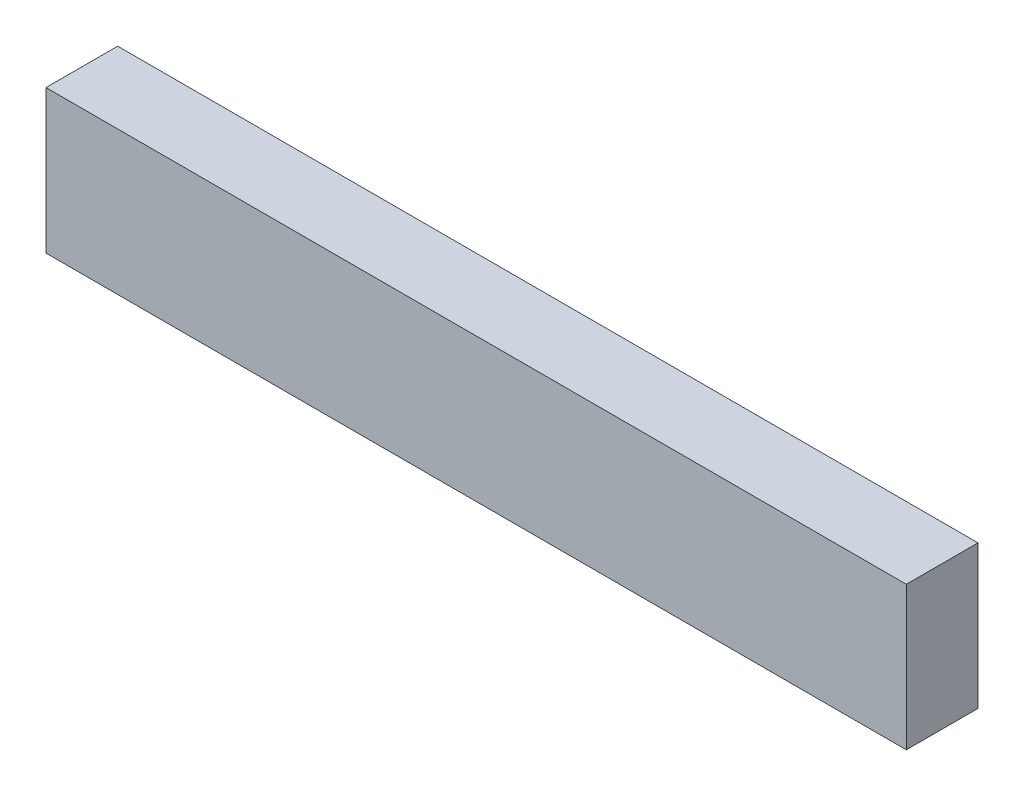
ISO-10303-21;
HEADER;
FILE_DESCRIPTION(('STEP AP214'),'2;1');
FILE_NAME('part.step','',(''),(''),'','','');
FILE_SCHEMA(('AUTOMOTIVE_DESIGN { 1 0 10303 214 1 1 1 1 }'));
ENDSEC;
DATA;
#1=APPLICATION_CONTEXT('core data for automotive mechanical design processes');
#2=APPLICATION_PROTOCOL_DEFINITION('international standard','automotive_design',2000,#1);
#3=PRODUCT_CONTEXT('',#1,'mechanical');
#4=PRODUCT('Part','Part','',(#3));
#5=PRODUCT_RELATED_PRODUCT_CATEGORY('part','',(#4));
#6=PRODUCT_DEFINITION_FORMATION('','',#4);
#7=PRODUCT_DEFINITION_CONTEXT('part definition',#1,'design');
#8=PRODUCT_DEFINITION('design','',#6,#7);
#9=PRODUCT_DEFINITION_SHAPE('','',#8);
#10=(LENGTH_UNIT() NAMED_UNIT(*) SI_UNIT(.MILLI.,.METRE.));
#11=(NAMED_UNIT(*) PLANE_ANGLE_UNIT() SI_UNIT($,.RADIAN.));
#12=(NAMED_UNIT(*) SI_UNIT($,.STERADIAN.) SOLID_ANGLE_UNIT());
#13=UNCERTAINTY_MEASURE_WITH_UNIT(LENGTH_MEASURE(1.E-05),#10,'distance_accuracy_value','');
#14=(GEOMETRIC_REPRESENTATION_CONTEXT(3) GLOBAL_UNCERTAINTY_ASSIGNED_CONTEXT((#13)) GLOBAL_UNIT_ASSIGNED_CONTEXT((#10,
#11,#12)) REPRESENTATION_CONTEXT('',''));
#15=CARTESIAN_POINT('',(0.,0.,0.));
#16=DIRECTION('',(0.,0.,1.));
#17=DIRECTION('',(1.,0.,0.));
#18=AXIS2_PLACEMENT_3D('',#15,#16,#17);
#19=CARTESIAN_POINT('',(304.8,-50.8,50.8));
#20=DIRECTION('',(-1.,0.,0.));
#21=DIRECTION('',(0.,0.,1.));
#22=AXIS2_PLACEMENT_3D('',#19,#20,#21);
#23=PLANE('',#22);
#24=DIRECTION('',(0.,1.,0.));
#25=VECTOR('',#24,1.);
#26=CARTESIAN_POINT('',(304.8,-50.8,0.));
#27=LINE('',#26,#25);
#28=CARTESIAN_POINT('',(304.8,-50.8,0.));
#29=VERTEX_POINT('',#28);
#30=CARTESIAN_POINT('',(304.8,50.8,0.));
#31=VERTEX_POINT('',#30);
#32=EDGE_CURVE('E96',#29,#31,#27,.T.);
#33=ORIENTED_EDGE('',*,*,#32,.T.);
#34=DIRECTION('',(0.,0.,-1.));
#35=VECTOR('',#34,1.);
#36=CARTESIAN_POINT('',(304.8,50.8,50.8));
#37=LINE('',#36,#35);
#38=CARTESIAN_POINT('',(304.8,50.8,50.8));
#39=VERTEX_POINT('',#38);
#40=EDGE_CURVE('E11',#39,#31,#37,.T.);
#41=ORIENTED_EDGE('',*,*,#40,.F.);
#42=DIRECTION('',(0.,1.,0.));
#43=VECTOR('',#42,1.);
#44=CARTESIAN_POINT('',(304.8,-50.8,50.8));
#45=LINE('',#44,#43);
#46=CARTESIAN_POINT('',(304.8,-50.8,50.8));
#47=VERTEX_POINT('',#46);
#48=EDGE_CURVE('E84',#47,#39,#45,.T.);
#49=ORIENTED_EDGE('',*,*,#48,.F.);
#50=DIRECTION('',(0.,0.,-1.));
#51=VECTOR('',#50,1.);
#52=CARTESIAN_POINT('',(304.8,-50.8,50.8));
#53=LINE('',#52,#51);
#54=EDGE_CURVE('E92',#47,#29,#53,.T.);
#55=ORIENTED_EDGE('',*,*,#54,.T.);
#56=EDGE_LOOP('',(#33,#41,#49,#55));
#57=FACE_BOUND('',#56,.T.);
#58=ADVANCED_FACE('F33',(#57),#23,.F.);
#59=CARTESIAN_POINT('',(-304.8,50.8,50.8));
#60=DIRECTION('',(0.,-1.,0.));
#61=DIRECTION('',(0.,0.,-1.));
#62=AXIS2_PLACEMENT_3D('',#59,#60,#61);
#63=PLANE('',#62);
#64=DIRECTION('',(-1.,0.,0.));
#65=VECTOR('',#64,1.);
#66=CARTESIAN_POINT('',(-304.8,50.8,0.));
#67=LINE('',#66,#65);
#68=CARTESIAN_POINT('',(-304.8,50.8,0.));
#69=VERTEX_POINT('',#68);
#70=EDGE_CURVE('E88',#31,#69,#67,.T.);
#71=ORIENTED_EDGE('',*,*,#70,.T.);
#72=DIRECTION('',(0.,0.,-1.));
#73=VECTOR('',#72,1.);
#74=CARTESIAN_POINT('',(-304.8,50.8,50.8));
#75=LINE('',#74,#73);
#76=CARTESIAN_POINT('',(-304.8,50.8,50.8));
#77=VERTEX_POINT('',#76);
#78=EDGE_CURVE('E41',#77,#69,#75,.T.);
#79=ORIENTED_EDGE('',*,*,#78,.F.);
#80=DIRECTION('',(-1.,0.,0.));
#81=VECTOR('',#80,1.);
#82=CARTESIAN_POINT('',(-304.8,50.8,50.8));
#83=LINE('',#82,#81);
#84=EDGE_CURVE('E79',#39,#77,#83,.T.);
#85=ORIENTED_EDGE('',*,*,#84,.F.);
#86=ORIENTED_EDGE('',*,*,#40,.T.);
#87=EDGE_LOOP('',(#71,#79,#85,#86));
#88=FACE_BOUND('',#87,.T.);
#89=ADVANCED_FACE('F87',(#88),#63,.F.);
#90=CARTESIAN_POINT('',(-304.8,-50.8,50.8));
#91=DIRECTION('',(1.,0.,0.));
#92=DIRECTION('',(0.,0.,-1.));
#93=AXIS2_PLACEMENT_3D('',#90,#91,#92);
#94=PLANE('',#93);
#95=DIRECTION('',(0.,-1.,0.));
#96=VECTOR('',#95,1.);
#97=CARTESIAN_POINT('',(-304.8,-50.8,0.));
#98=LINE('',#97,#96);
#99=CARTESIAN_POINT('',(-304.8,-50.8,0.));
#100=VERTEX_POINT('',#99);
#101=EDGE_CURVE('E66',#69,#100,#98,.T.);
#102=ORIENTED_EDGE('',*,*,#101,.T.);
#103=DIRECTION('',(0.,0.,-1.));
#104=VECTOR('',#103,1.);
#105=CARTESIAN_POINT('',(-304.8,-50.8,50.8));
#106=LINE('',#105,#104);
#107=CARTESIAN_POINT('',(-304.8,-50.8,50.8));
#108=VERTEX_POINT('',#107);
#109=EDGE_CURVE('E89',#108,#100,#106,.T.);
#110=ORIENTED_EDGE('',*,*,#109,.F.);
#111=DIRECTION('',(0.,-1.,0.));
#112=VECTOR('',#111,1.);
#113=CARTESIAN_POINT('',(-304.8,-50.8,50.8));
#114=LINE('',#113,#112);
#115=EDGE_CURVE('E82',#77,#108,#114,.T.);
#116=ORIENTED_EDGE('',*,*,#115,.F.);
#117=ORIENTED_EDGE('',*,*,#78,.T.);
#118=EDGE_LOOP('',(#102,#110,#116,#117));
#119=FACE_BOUND('',#118,.T.);
#120=ADVANCED_FACE('F90',(#119),#94,.F.);
#121=CARTESIAN_POINT('',(-304.8,-50.8,50.8));
#122=DIRECTION('',(0.,1.,0.));
#123=DIRECTION('',(0.,0.,1.));
#124=AXIS2_PLACEMENT_3D('',#121,#122,#123);
#125=PLANE('',#124);
#126=DIRECTION('',(1.,0.,0.));
#127=VECTOR('',#126,1.);
#128=CARTESIAN_POINT('',(-304.8,-50.8,0.));
#129=LINE('',#128,#127);
#130=EDGE_CURVE('E72',#100,#29,#129,.T.);
#131=ORIENTED_EDGE('',*,*,#130,.T.);
#132=ORIENTED_EDGE('',*,*,#54,.F.);
#133=DIRECTION('',(1.,0.,0.));
#134=VECTOR('',#133,1.);
#135=CARTESIAN_POINT('',(-304.8,-50.8,50.8));
#136=LINE('',#135,#134);
#137=EDGE_CURVE('E49',#108,#47,#136,.T.);
#138=ORIENTED_EDGE('',*,*,#137,.F.);
#139=ORIENTED_EDGE('',*,*,#109,.T.);
#140=EDGE_LOOP('',(#131,#132,#138,#139));
#141=FACE_BOUND('',#140,.T.);
#142=ADVANCED_FACE('F103',(#141),#125,.F.);
#143=CARTESIAN_POINT('',(0.,0.,50.8));
#144=DIRECTION('',(0.,0.,-1.));
#145=DIRECTION('',(-1.,0.,0.));
#146=AXIS2_PLACEMENT_3D('',#143,#144,#145);
#147=PLANE('',#146);
#148=ORIENTED_EDGE('',*,*,#48,.T.);
#149=ORIENTED_EDGE('',*,*,#84,.T.);
#150=ORIENTED_EDGE('',*,*,#115,.T.);
#151=ORIENTED_EDGE('',*,*,#137,.T.);
#152=EDGE_LOOP('',(#148,#149,#150,#151));
#153=FACE_BOUND('',#152,.T.);
#154=ADVANCED_FACE('F80',(#153),#147,.F.);
#155=CARTESIAN_POINT('',(0.,0.,0.));
#156=DIRECTION('',(0.,0.,-1.));
#157=DIRECTION('',(-1.,0.,0.));
#158=AXIS2_PLACEMENT_3D('',#155,#156,#157);
#159=PLANE('',#158);
#160=ORIENTED_EDGE('',*,*,#32,.F.);
#161=ORIENTED_EDGE('',*,*,#130,.F.);
#162=ORIENTED_EDGE('',*,*,#101,.F.);
#163=ORIENTED_EDGE('',*,*,#70,.F.);
#164=EDGE_LOOP('',(#160,#161,#162,#163));
#165=FACE_BOUND('',#164,.T.);
#166=ADVANCED_FACE('F106',(#165),#159,.T.);
#167=CLOSED_SHELL('',(#58,#89,#120,#142,#154,#166));
#168=MANIFOLD_SOLID_BREP('B2',#167);
#169=ADVANCED_BREP_SHAPE_REPRESENTATION('',(#18,#168),#14);
#170=SHAPE_DEFINITION_REPRESENTATION(#9,#169);
ENDSEC;
END-ISO-10303-21;
